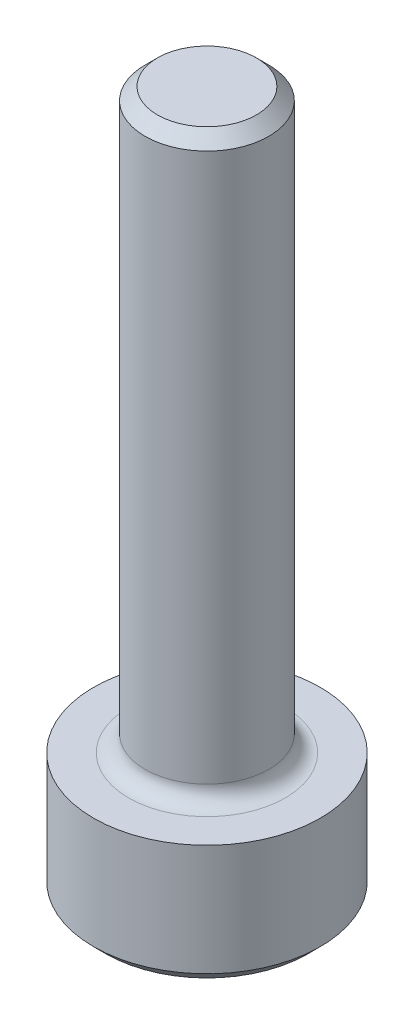
ISO-10303-21;
HEADER;
FILE_DESCRIPTION(('STEP AP214'),'2;1');
FILE_NAME('part.step','',(''),(''),'','','');
FILE_SCHEMA(('AUTOMOTIVE_DESIGN { 1 0 10303 214 1 1 1 1 }'));
ENDSEC;
DATA;
#1=APPLICATION_CONTEXT('core data for automotive mechanical design processes');
#2=APPLICATION_PROTOCOL_DEFINITION('international standard','automotive_design',2000,#1);
#3=PRODUCT_CONTEXT('',#1,'mechanical');
#4=PRODUCT('Part','Part','',(#3));
#5=PRODUCT_RELATED_PRODUCT_CATEGORY('part','',(#4));
#6=PRODUCT_DEFINITION_FORMATION('','',#4);
#7=PRODUCT_DEFINITION_CONTEXT('part definition',#1,'design');
#8=PRODUCT_DEFINITION('design','',#6,#7);
#9=PRODUCT_DEFINITION_SHAPE('','',#8);
#10=(LENGTH_UNIT() NAMED_UNIT(*) SI_UNIT(.MILLI.,.METRE.));
#11=(NAMED_UNIT(*) PLANE_ANGLE_UNIT() SI_UNIT($,.RADIAN.));
#12=(NAMED_UNIT(*) SI_UNIT($,.STERADIAN.) SOLID_ANGLE_UNIT());
#13=UNCERTAINTY_MEASURE_WITH_UNIT(LENGTH_MEASURE(1.E-05),#10,'distance_accuracy_value','');
#14=(GEOMETRIC_REPRESENTATION_CONTEXT(3) GLOBAL_UNCERTAINTY_ASSIGNED_CONTEXT((#13)) GLOBAL_UNIT_ASSIGNED_CONTEXT((#10,
#11,#12)) REPRESENTATION_CONTEXT('',''));
#15=CARTESIAN_POINT('',(0.,0.,0.));
#16=DIRECTION('',(0.,0.,1.));
#17=DIRECTION('',(1.,0.,0.));
#18=AXIS2_PLACEMENT_3D('',#15,#16,#17);
#19=CARTESIAN_POINT('',(0.,14.,0.));
#20=DIRECTION('',(0.,-1.,0.));
#21=DIRECTION('',(0.,0.,-1.));
#22=AXIS2_PLACEMENT_3D('',#19,#20,#21);
#23=CYLINDRICAL_SURFACE('',#22,1.5);
#24=CARTESIAN_POINT('',(0.,13.7,0.));
#25=DIRECTION('',(0.,1.,0.));
#26=DIRECTION('',(0.,0.,1.));
#27=AXIS2_PLACEMENT_3D('',#24,#25,#26);
#28=CIRCLE('',#27,1.5);
#29=CARTESIAN_POINT('',(0.,13.7,1.5));
#30=VERTEX_POINT('',#29);
#31=EDGE_CURVE('E11',#30,#30,#28,.F.);
#32=ORIENTED_EDGE('',*,*,#31,.T.);
#33=EDGE_LOOP('',(#32));
#34=FACE_BOUND('',#33,.T.);
#35=CARTESIAN_POINT('',(0.,0.399999999999999,0.));
#36=DIRECTION('',(0.,1.,0.));
#37=DIRECTION('',(0.,0.,1.));
#38=AXIS2_PLACEMENT_3D('',#35,#36,#37);
#39=CIRCLE('',#38,1.5);
#40=CARTESIAN_POINT('',(0.,0.399999999999999,1.5));
#41=VERTEX_POINT('',#40);
#42=EDGE_CURVE('E145',#41,#41,#39,.T.);
#43=ORIENTED_EDGE('',*,*,#42,.T.);
#44=EDGE_LOOP('',(#43));
#45=FACE_BOUND('',#44,.T.);
#46=ADVANCED_FACE('F35',(#34,#45),#23,.T.);
#47=CARTESIAN_POINT('',(0.,14.,0.));
#48=DIRECTION('',(0.,1.,0.));
#49=DIRECTION('',(0.,0.,1.));
#50=AXIS2_PLACEMENT_3D('',#47,#48,#49);
#51=PLANE('',#50);
#52=CARTESIAN_POINT('',(0.,14.,0.));
#53=DIRECTION('',(0.,1.,0.));
#54=DIRECTION('',(0.,0.,1.));
#55=AXIS2_PLACEMENT_3D('',#52,#53,#54);
#56=CIRCLE('',#55,1.2);
#57=CARTESIAN_POINT('',(0.,14.,1.2));
#58=VERTEX_POINT('',#57);
#59=EDGE_CURVE('E43',#58,#58,#56,.T.);
#60=ORIENTED_EDGE('',*,*,#59,.T.);
#61=EDGE_LOOP('',(#60));
#62=FACE_BOUND('',#61,.T.);
#63=ADVANCED_FACE('F159',(#62),#51,.T.);
#64=CARTESIAN_POINT('',(0.,-3.,0.));
#65=DIRECTION('',(0.,1.,0.));
#66=DIRECTION('',(0.,0.,1.));
#67=AXIS2_PLACEMENT_3D('',#64,#65,#66);
#68=CYLINDRICAL_SURFACE('',#67,2.75);
#69=CARTESIAN_POINT('',(0.,-2.7,0.));
#70=DIRECTION('',(0.,1.,0.));
#71=DIRECTION('',(0.,0.,1.));
#72=AXIS2_PLACEMENT_3D('',#69,#70,#71);
#73=CIRCLE('',#72,2.75);
#74=CARTESIAN_POINT('',(0.,-2.7,2.75));
#75=VERTEX_POINT('',#74);
#76=EDGE_CURVE('E151',#75,#75,#73,.T.);
#77=ORIENTED_EDGE('',*,*,#76,.T.);
#78=EDGE_LOOP('',(#77));
#79=FACE_BOUND('',#78,.T.);
#80=CARTESIAN_POINT('',(0.,0.,0.));
#81=DIRECTION('',(0.,1.,0.));
#82=DIRECTION('',(0.,0.,1.));
#83=AXIS2_PLACEMENT_3D('',#80,#81,#82);
#84=CIRCLE('',#83,2.75);
#85=CARTESIAN_POINT('',(0.,0.,2.75));
#86=VERTEX_POINT('',#85);
#87=EDGE_CURVE('E137',#86,#86,#84,.T.);
#88=ORIENTED_EDGE('',*,*,#87,.F.);
#89=EDGE_LOOP('',(#88));
#90=FACE_BOUND('',#89,.T.);
#91=ADVANCED_FACE('F180',(#79,#90),#68,.T.);
#92=CARTESIAN_POINT('',(0.,-3.,0.));
#93=DIRECTION('',(0.,1.,0.));
#94=DIRECTION('',(0.,0.,1.));
#95=AXIS2_PLACEMENT_3D('',#92,#93,#94);
#96=PLANE('',#95);
#97=DIRECTION('',(-0.866025403784439,0.,-0.5));
#98=VECTOR('',#97,1.);
#99=CARTESIAN_POINT('',(0.,-3.,1.44337567297406));
#100=LINE('',#99,#98);
#101=CARTESIAN_POINT('',(0.,-3.,1.44337567297406));
#102=VERTEX_POINT('',#101);
#103=CARTESIAN_POINT('',(-1.25,-3.,0.721687836487032));
#104=VERTEX_POINT('',#103);
#105=EDGE_CURVE('E124',#102,#104,#100,.T.);
#106=ORIENTED_EDGE('',*,*,#105,.F.);
#107=DIRECTION('',(-0.866025403784439,0.,0.5));
#108=VECTOR('',#107,1.);
#109=CARTESIAN_POINT('',(1.25,-3.,0.721687836487033));
#110=LINE('',#109,#108);
#111=CARTESIAN_POINT('',(1.25,-3.,0.721687836487033));
#112=VERTEX_POINT('',#111);
#113=EDGE_CURVE('E50',#112,#102,#110,.T.);
#114=ORIENTED_EDGE('',*,*,#113,.F.);
#115=DIRECTION('',(0.,0.,1.));
#116=VECTOR('',#115,1.);
#117=CARTESIAN_POINT('',(1.25,-3.,-0.721687836487033));
#118=LINE('',#117,#116);
#119=CARTESIAN_POINT('',(1.25,-3.,-0.721687836487033));
#120=VERTEX_POINT('',#119);
#121=EDGE_CURVE('E133',#120,#112,#118,.T.);
#122=ORIENTED_EDGE('',*,*,#121,.F.);
#123=DIRECTION('',(0.866025403784439,0.,0.5));
#124=VECTOR('',#123,1.);
#125=CARTESIAN_POINT('',(0.,-3.,-1.44337567297406));
#126=LINE('',#125,#124);
#127=CARTESIAN_POINT('',(0.,-3.,-1.44337567297406));
#128=VERTEX_POINT('',#127);
#129=EDGE_CURVE('E131',#128,#120,#126,.T.);
#130=ORIENTED_EDGE('',*,*,#129,.F.);
#131=DIRECTION('',(0.866025403784439,0.,-0.5));
#132=VECTOR('',#131,1.);
#133=CARTESIAN_POINT('',(-1.25,-3.,-0.721687836487033));
#134=LINE('',#133,#132);
#135=CARTESIAN_POINT('',(-1.25,-3.,-0.721687836487033));
#136=VERTEX_POINT('',#135);
#137=EDGE_CURVE('E98',#136,#128,#134,.T.);
#138=ORIENTED_EDGE('',*,*,#137,.F.);
#139=DIRECTION('',(0.,0.,-1.));
#140=VECTOR('',#139,1.);
#141=CARTESIAN_POINT('',(-1.25,-3.,0.721687836487032));
#142=LINE('',#141,#140);
#143=EDGE_CURVE('E127',#104,#136,#142,.T.);
#144=ORIENTED_EDGE('',*,*,#143,.F.);
#145=EDGE_LOOP('',(#106,#114,#122,#130,#138,#144));
#146=FACE_BOUND('',#145,.T.);
#147=CARTESIAN_POINT('',(0.,-3.,0.));
#148=DIRECTION('',(0.,1.,0.));
#149=DIRECTION('',(0.,0.,1.));
#150=AXIS2_PLACEMENT_3D('',#147,#148,#149);
#151=CIRCLE('',#150,2.45);
#152=CARTESIAN_POINT('',(0.,-3.,2.45));
#153=VERTEX_POINT('',#152);
#154=EDGE_CURVE('E154',#153,#153,#151,.F.);
#155=ORIENTED_EDGE('',*,*,#154,.T.);
#156=EDGE_LOOP('',(#155));
#157=FACE_BOUND('',#156,.T.);
#158=ADVANCED_FACE('F191',(#146,#157),#96,.F.);
#159=CARTESIAN_POINT('',(0.,0.,0.));
#160=DIRECTION('',(0.,1.,0.));
#161=DIRECTION('',(0.,0.,1.));
#162=AXIS2_PLACEMENT_3D('',#159,#160,#161);
#163=PLANE('',#162);
#164=CARTESIAN_POINT('',(0.,0.,0.));
#165=DIRECTION('',(0.,1.,0.));
#166=DIRECTION('',(0.,0.,1.));
#167=AXIS2_PLACEMENT_3D('',#164,#165,#166);
#168=CIRCLE('',#167,1.9);
#169=CARTESIAN_POINT('',(0.,0.,1.9));
#170=VERTEX_POINT('',#169);
#171=EDGE_CURVE('E148',#170,#170,#168,.F.);
#172=ORIENTED_EDGE('',*,*,#171,.T.);
#173=EDGE_LOOP('',(#172));
#174=FACE_BOUND('',#173,.T.);
#175=ORIENTED_EDGE('',*,*,#87,.T.);
#176=EDGE_LOOP('',(#175));
#177=FACE_BOUND('',#176,.T.);
#178=ADVANCED_FACE('F186',(#174,#177),#163,.T.);
#179=CARTESIAN_POINT('',(0.,0.399999999999999,0.));
#180=DIRECTION('',(0.,1.,0.));
#181=DIRECTION('',(0.,0.,1.));
#182=AXIS2_PLACEMENT_3D('',#179,#180,#181);
#183=TOROIDAL_SURFACE('',#182,1.9,0.4);
#184=ORIENTED_EDGE('',*,*,#171,.F.);
#185=EDGE_LOOP('',(#184));
#186=FACE_BOUND('',#185,.T.);
#187=ORIENTED_EDGE('',*,*,#42,.F.);
#188=EDGE_LOOP('',(#187));
#189=FACE_BOUND('',#188,.T.);
#190=ADVANCED_FACE('F171',(#186,#189),#183,.F.);
#191=CARTESIAN_POINT('',(0.,-2.7,0.));
#192=DIRECTION('',(0.,1.,0.));
#193=DIRECTION('',(0.,0.,1.));
#194=AXIS2_PLACEMENT_3D('',#191,#192,#193);
#195=CONICAL_SURFACE('',#194,2.75,0.78539816339745);
#196=ORIENTED_EDGE('',*,*,#154,.F.);
#197=EDGE_LOOP('',(#196));
#198=FACE_BOUND('',#197,.T.);
#199=ORIENTED_EDGE('',*,*,#76,.F.);
#200=EDGE_LOOP('',(#199));
#201=FACE_BOUND('',#200,.T.);
#202=ADVANCED_FACE('F163',(#198,#201),#195,.T.);
#203=CARTESIAN_POINT('',(0.,14.,0.));
#204=DIRECTION('',(0.,-1.,0.));
#205=DIRECTION('',(0.,0.,-1.));
#206=AXIS2_PLACEMENT_3D('',#203,#204,#205);
#207=CONICAL_SURFACE('',#206,1.2,0.785398163397447);
#208=ORIENTED_EDGE('',*,*,#31,.F.);
#209=EDGE_LOOP('',(#208));
#210=FACE_BOUND('',#209,.T.);
#211=ORIENTED_EDGE('',*,*,#59,.F.);
#212=EDGE_LOOP('',(#211));
#213=FACE_BOUND('',#212,.T.);
#214=ADVANCED_FACE('F37',(#210,#213),#207,.T.);
#215=CARTESIAN_POINT('',(1.25,-0.5,0.721687836487033));
#216=DIRECTION('',(0.5,0.,0.866025403784439));
#217=DIRECTION('',(0.866025403784439,0.,-0.5));
#218=AXIS2_PLACEMENT_3D('',#215,#216,#217);
#219=PLANE('',#218);
#220=ORIENTED_EDGE('',*,*,#113,.T.);
#221=DIRECTION('',(0.,-1.,0.));
#222=VECTOR('',#221,1.);
#223=CARTESIAN_POINT('',(0.,-0.5,1.44337567297406));
#224=LINE('',#223,#222);
#225=CARTESIAN_POINT('',(0.,-0.5,1.44337567297406));
#226=VERTEX_POINT('',#225);
#227=EDGE_CURVE('E80',#226,#102,#224,.T.);
#228=ORIENTED_EDGE('',*,*,#227,.F.);
#229=DIRECTION('',(-0.866025403784439,0.,0.5));
#230=VECTOR('',#229,1.);
#231=CARTESIAN_POINT('',(1.25,-0.5,0.721687836487033));
#232=LINE('',#231,#230);
#233=CARTESIAN_POINT('',(1.25,-0.5,0.721687836487033));
#234=VERTEX_POINT('',#233);
#235=EDGE_CURVE('E135',#234,#226,#232,.T.);
#236=ORIENTED_EDGE('',*,*,#235,.F.);
#237=DIRECTION('',(0.,-1.,0.));
#238=VECTOR('',#237,1.);
#239=CARTESIAN_POINT('',(1.25,-0.5,0.721687836487033));
#240=LINE('',#239,#238);
#241=EDGE_CURVE('E58',#234,#112,#240,.T.);
#242=ORIENTED_EDGE('',*,*,#241,.T.);
#243=EDGE_LOOP('',(#220,#228,#236,#242));
#244=FACE_BOUND('',#243,.T.);
#245=ADVANCED_FACE('F162',(#244),#219,.F.);
#246=CARTESIAN_POINT('',(1.25,-0.5,-0.721687836487033));
#247=DIRECTION('',(1.,0.,0.));
#248=DIRECTION('',(0.,0.,-1.));
#249=AXIS2_PLACEMENT_3D('',#246,#247,#248);
#250=PLANE('',#249);
#251=ORIENTED_EDGE('',*,*,#121,.T.);
#252=ORIENTED_EDGE('',*,*,#241,.F.);
#253=DIRECTION('',(0.,0.,1.));
#254=VECTOR('',#253,1.);
#255=CARTESIAN_POINT('',(1.25,-0.5,-0.721687836487033));
#256=LINE('',#255,#254);
#257=CARTESIAN_POINT('',(1.25,-0.5,-0.721687836487033));
#258=VERTEX_POINT('',#257);
#259=EDGE_CURVE('E110',#258,#234,#256,.T.);
#260=ORIENTED_EDGE('',*,*,#259,.F.);
#261=DIRECTION('',(0.,-1.,0.));
#262=VECTOR('',#261,1.);
#263=CARTESIAN_POINT('',(1.25,-0.5,-0.721687836487033));
#264=LINE('',#263,#262);
#265=EDGE_CURVE('E102',#258,#120,#264,.T.);
#266=ORIENTED_EDGE('',*,*,#265,.T.);
#267=EDGE_LOOP('',(#251,#252,#260,#266));
#268=FACE_BOUND('',#267,.T.);
#269=ADVANCED_FACE('F169',(#268),#250,.F.);
#270=CARTESIAN_POINT('',(0.,-0.5,-1.44337567297406));
#271=DIRECTION('',(0.5,0.,-0.866025403784439));
#272=DIRECTION('',(-0.866025403784439,0.,-0.5));
#273=AXIS2_PLACEMENT_3D('',#270,#271,#272);
#274=PLANE('',#273);
#275=ORIENTED_EDGE('',*,*,#129,.T.);
#276=ORIENTED_EDGE('',*,*,#265,.F.);
#277=DIRECTION('',(0.866025403784439,0.,0.5));
#278=VECTOR('',#277,1.);
#279=CARTESIAN_POINT('',(0.,-0.5,-1.44337567297406));
#280=LINE('',#279,#278);
#281=CARTESIAN_POINT('',(0.,-0.5,-1.44337567297406));
#282=VERTEX_POINT('',#281);
#283=EDGE_CURVE('E106',#282,#258,#280,.T.);
#284=ORIENTED_EDGE('',*,*,#283,.F.);
#285=DIRECTION('',(0.,-1.,0.));
#286=VECTOR('',#285,1.);
#287=CARTESIAN_POINT('',(0.,-0.5,-1.44337567297406));
#288=LINE('',#287,#286);
#289=EDGE_CURVE('E91',#282,#128,#288,.T.);
#290=ORIENTED_EDGE('',*,*,#289,.T.);
#291=EDGE_LOOP('',(#275,#276,#284,#290));
#292=FACE_BOUND('',#291,.T.);
#293=ADVANCED_FACE('F107',(#292),#274,.F.);
#294=CARTESIAN_POINT('',(-1.25,-0.5,-0.721687836487033));
#295=DIRECTION('',(-0.5,0.,-0.866025403784439));
#296=DIRECTION('',(-0.866025403784439,0.,0.5));
#297=AXIS2_PLACEMENT_3D('',#294,#295,#296);
#298=PLANE('',#297);
#299=ORIENTED_EDGE('',*,*,#137,.T.);
#300=ORIENTED_EDGE('',*,*,#289,.F.);
#301=DIRECTION('',(0.866025403784439,0.,-0.5));
#302=VECTOR('',#301,1.);
#303=CARTESIAN_POINT('',(-1.25,-0.5,-0.721687836487033));
#304=LINE('',#303,#302);
#305=CARTESIAN_POINT('',(-1.25,-0.5,-0.721687836487033));
#306=VERTEX_POINT('',#305);
#307=EDGE_CURVE('E95',#306,#282,#304,.T.);
#308=ORIENTED_EDGE('',*,*,#307,.F.);
#309=DIRECTION('',(0.,-1.,0.));
#310=VECTOR('',#309,1.);
#311=CARTESIAN_POINT('',(-1.25,-0.5,-0.721687836487033));
#312=LINE('',#311,#310);
#313=EDGE_CURVE('E103',#306,#136,#312,.T.);
#314=ORIENTED_EDGE('',*,*,#313,.T.);
#315=EDGE_LOOP('',(#299,#300,#308,#314));
#316=FACE_BOUND('',#315,.T.);
#317=ADVANCED_FACE('F93',(#316),#298,.F.);
#318=CARTESIAN_POINT('',(-1.25,-0.5,0.721687836487032));
#319=DIRECTION('',(-1.,0.,0.));
#320=DIRECTION('',(0.,0.,1.));
#321=AXIS2_PLACEMENT_3D('',#318,#319,#320);
#322=PLANE('',#321);
#323=ORIENTED_EDGE('',*,*,#143,.T.);
#324=ORIENTED_EDGE('',*,*,#313,.F.);
#325=DIRECTION('',(0.,0.,-1.));
#326=VECTOR('',#325,1.);
#327=CARTESIAN_POINT('',(-1.25,-0.5,0.721687836487032));
#328=LINE('',#327,#326);
#329=CARTESIAN_POINT('',(-1.25,-0.5,0.721687836487032));
#330=VERTEX_POINT('',#329);
#331=EDGE_CURVE('E116',#330,#306,#328,.T.);
#332=ORIENTED_EDGE('',*,*,#331,.F.);
#333=DIRECTION('',(0.,-1.,0.));
#334=VECTOR('',#333,1.);
#335=CARTESIAN_POINT('',(-1.25,-0.5,0.721687836487032));
#336=LINE('',#335,#334);
#337=EDGE_CURVE('E140',#330,#104,#336,.T.);
#338=ORIENTED_EDGE('',*,*,#337,.T.);
#339=EDGE_LOOP('',(#323,#324,#332,#338));
#340=FACE_BOUND('',#339,.T.);
#341=ADVANCED_FACE('F211',(#340),#322,.F.);
#342=CARTESIAN_POINT('',(0.,-0.5,1.44337567297406));
#343=DIRECTION('',(-0.5,0.,0.866025403784439));
#344=DIRECTION('',(0.866025403784439,0.,0.5));
#345=AXIS2_PLACEMENT_3D('',#342,#343,#344);
#346=PLANE('',#345);
#347=ORIENTED_EDGE('',*,*,#105,.T.);
#348=ORIENTED_EDGE('',*,*,#337,.F.);
#349=DIRECTION('',(-0.866025403784439,0.,-0.5));
#350=VECTOR('',#349,1.);
#351=CARTESIAN_POINT('',(0.,-0.5,1.44337567297406));
#352=LINE('',#351,#350);
#353=EDGE_CURVE('E118',#226,#330,#352,.T.);
#354=ORIENTED_EDGE('',*,*,#353,.F.);
#355=ORIENTED_EDGE('',*,*,#227,.T.);
#356=EDGE_LOOP('',(#347,#348,#354,#355));
#357=FACE_BOUND('',#356,.T.);
#358=ADVANCED_FACE('F208',(#357),#346,.F.);
#359=CARTESIAN_POINT('',(0.,-0.5,0.));
#360=DIRECTION('',(0.,-1.,0.));
#361=DIRECTION('',(0.,0.,-1.));
#362=AXIS2_PLACEMENT_3D('',#359,#360,#361);
#363=PLANE('',#362);
#364=ORIENTED_EDGE('',*,*,#235,.T.);
#365=ORIENTED_EDGE('',*,*,#353,.T.);
#366=ORIENTED_EDGE('',*,*,#331,.T.);
#367=ORIENTED_EDGE('',*,*,#307,.T.);
#368=ORIENTED_EDGE('',*,*,#283,.T.);
#369=ORIENTED_EDGE('',*,*,#259,.T.);
#370=EDGE_LOOP('',(#364,#365,#366,#367,#368,#369));
#371=FACE_BOUND('',#370,.T.);
#372=ADVANCED_FACE('F113',(#371),#363,.T.);
#373=CLOSED_SHELL('',(#46,#63,#91,#158,#178,#190,#202,#214,#245,#269,#293,#317,#341,#358,#372));
#374=MANIFOLD_SOLID_BREP('B2',#373);
#375=ADVANCED_BREP_SHAPE_REPRESENTATION('',(#18,#374),#14);
#376=SHAPE_DEFINITION_REPRESENTATION(#9,#375);
ENDSEC;
END-ISO-10303-21;
